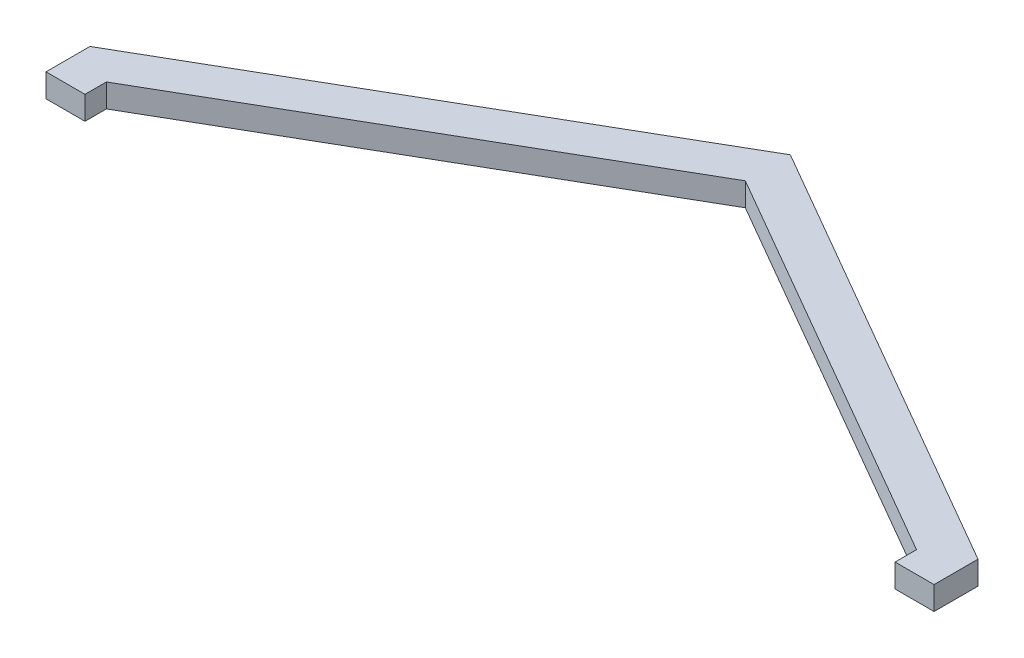
ISO-10303-21;
HEADER;
FILE_DESCRIPTION(('STEP AP214'),'2;1');
FILE_NAME('part.step','',(''),(''),'','','');
FILE_SCHEMA(('AUTOMOTIVE_DESIGN { 1 0 10303 214 1 1 1 1 }'));
ENDSEC;
DATA;
#1=APPLICATION_CONTEXT('core data for automotive mechanical design processes');
#2=APPLICATION_PROTOCOL_DEFINITION('international standard','automotive_design',2000,#1);
#3=PRODUCT_CONTEXT('',#1,'mechanical');
#4=PRODUCT('Part','Part','',(#3));
#5=PRODUCT_RELATED_PRODUCT_CATEGORY('part','',(#4));
#6=PRODUCT_DEFINITION_FORMATION('','',#4);
#7=PRODUCT_DEFINITION_CONTEXT('part definition',#1,'design');
#8=PRODUCT_DEFINITION('design','',#6,#7);
#9=PRODUCT_DEFINITION_SHAPE('','',#8);
#10=(LENGTH_UNIT() NAMED_UNIT(*) SI_UNIT(.MILLI.,.METRE.));
#11=(NAMED_UNIT(*) PLANE_ANGLE_UNIT() SI_UNIT($,.RADIAN.));
#12=(NAMED_UNIT(*) SI_UNIT($,.STERADIAN.) SOLID_ANGLE_UNIT());
#13=UNCERTAINTY_MEASURE_WITH_UNIT(LENGTH_MEASURE(1.E-05),#10,'distance_accuracy_value','');
#14=(GEOMETRIC_REPRESENTATION_CONTEXT(3) GLOBAL_UNCERTAINTY_ASSIGNED_CONTEXT((#13)) GLOBAL_UNIT_ASSIGNED_CONTEXT((#10,
#11,#12)) REPRESENTATION_CONTEXT('',''));
#15=CARTESIAN_POINT('',(0.,0.,0.));
#16=DIRECTION('',(0.,0.,1.));
#17=DIRECTION('',(1.,0.,0.));
#18=AXIS2_PLACEMENT_3D('',#15,#16,#17);
#19=CARTESIAN_POINT('',(-71.9715242270662,-8.99999999999997,-27.25));
#20=DIRECTION('',(0.,-1.,0.));
#21=DIRECTION('',(0.,0.,-1.));
#22=AXIS2_PLACEMENT_3D('',#19,#20,#21);
#23=PLANE('',#22);
#24=DIRECTION('',(-0.866025403784439,0.,0.5));
#25=VECTOR('',#24,1.);
#26=CARTESIAN_POINT('',(0.,-9.,-65.7735026918963));
#27=LINE('',#26,#25);
#28=CARTESIAN_POINT('',(0.,-8.99999999999997,-65.7735026918963));
#29=VERTEX_POINT('',#28);
#30=CARTESIAN_POINT('',(-56.9615242270663,-9.,-32.8867513459481));
#31=VERTEX_POINT('',#30);
#32=EDGE_CURVE('E59',#29,#31,#27,.T.);
#33=ORIENTED_EDGE('',*,*,#32,.F.);
#34=DIRECTION('',(-0.866025403784439,0.,-0.5));
#35=VECTOR('',#34,1.);
#36=CARTESIAN_POINT('',(56.9615242270663,-9.,-32.8867513459481));
#37=LINE('',#36,#35);
#38=CARTESIAN_POINT('',(56.9615242270663,-9.,-32.8867513459481));
#39=VERTEX_POINT('',#38);
#40=EDGE_CURVE('E121',#39,#29,#37,.T.);
#41=ORIENTED_EDGE('',*,*,#40,.F.);
#42=DIRECTION('',(0.,0.,-1.));
#43=VECTOR('',#42,1.);
#44=CARTESIAN_POINT('',(56.9615242270663,-9.,0.));
#45=LINE('',#44,#43);
#46=CARTESIAN_POINT('',(56.9615242270663,-9.,-27.25));
#47=VERTEX_POINT('',#46);
#48=EDGE_CURVE('E119',#47,#39,#45,.T.);
#49=ORIENTED_EDGE('',*,*,#48,.F.);
#50=DIRECTION('',(1.,0.,0.));
#51=VECTOR('',#50,1.);
#52=CARTESIAN_POINT('',(-113.272742430532,-8.99999999999997,-27.25));
#53=LINE('',#52,#51);
#54=CARTESIAN_POINT('',(51.9615242270662,-8.99999999999997,-27.25));
#55=VERTEX_POINT('',#54);
#56=EDGE_CURVE('E11',#55,#47,#53,.T.);
#57=ORIENTED_EDGE('',*,*,#56,.F.);
#58=DIRECTION('',(0.,0.,1.));
#59=VECTOR('',#58,1.);
#60=CARTESIAN_POINT('',(51.9615242270663,-8.99999999999997,-1.8027775184846E-13));
#61=LINE('',#60,#59);
#62=CARTESIAN_POINT('',(51.9615242270662,-8.99999999999997,-29.9999999999998));
#63=VERTEX_POINT('',#62);
#64=EDGE_CURVE('E162',#63,#55,#61,.T.);
#65=ORIENTED_EDGE('',*,*,#64,.F.);
#66=DIRECTION('',(0.866025403784438,0.,0.500000000000001));
#67=VECTOR('',#66,1.);
#68=CARTESIAN_POINT('',(25.9807621135331,-8.99999999999997,-44.9999999999998));
#69=LINE('',#68,#67);
#70=CARTESIAN_POINT('',(0.,-8.99999999999997,-59.9999999999999));
#71=VERTEX_POINT('',#70);
#72=EDGE_CURVE('E164',#71,#63,#69,.T.);
#73=ORIENTED_EDGE('',*,*,#72,.F.);
#74=DIRECTION('',(0.866025403784439,0.,-0.499999999999999));
#75=VECTOR('',#74,1.);
#76=CARTESIAN_POINT('',(-25.9807621135331,-8.99999999999997,-44.9999999999999));
#77=LINE('',#76,#75);
#78=CARTESIAN_POINT('',(-51.9615242270664,-8.99999999999997,-29.9999999999999));
#79=VERTEX_POINT('',#78);
#80=EDGE_CURVE('E166',#79,#71,#77,.T.);
#81=ORIENTED_EDGE('',*,*,#80,.F.);
#82=DIRECTION('',(0.,0.,-1.));
#83=VECTOR('',#82,1.);
#84=CARTESIAN_POINT('',(-51.9615242270664,-8.99999999999997,0.));
#85=LINE('',#84,#83);
#86=CARTESIAN_POINT('',(-51.9615242270664,-8.99999999999997,-27.25));
#87=VERTEX_POINT('',#86);
#88=EDGE_CURVE('E46',#87,#79,#85,.T.);
#89=ORIENTED_EDGE('',*,*,#88,.F.);
#90=DIRECTION('',(1.,0.,0.));
#91=VECTOR('',#90,1.);
#92=CARTESIAN_POINT('',(-113.272742430532,-8.99999999999997,-27.25));
#93=LINE('',#92,#91);
#94=CARTESIAN_POINT('',(-56.9615242270663,-9.,-27.25));
#95=VERTEX_POINT('',#94);
#96=EDGE_CURVE('E51',#95,#87,#93,.T.);
#97=ORIENTED_EDGE('',*,*,#96,.F.);
#98=DIRECTION('',(0.,0.,1.));
#99=VECTOR('',#98,1.);
#100=CARTESIAN_POINT('',(-56.9615242270663,-9.,-32.8867513459481));
#101=LINE('',#100,#99);
#102=EDGE_CURVE('E150',#31,#95,#101,.T.);
#103=ORIENTED_EDGE('',*,*,#102,.F.);
#104=EDGE_LOOP('',(#33,#41,#49,#57,#65,#73,#81,#89,#97,#103));
#105=FACE_BOUND('',#104,.T.);
#106=ADVANCED_FACE('F43',(#105),#23,.T.);
#107=CARTESIAN_POINT('',(-25.9807621135331,-12.,-44.9999999999999));
#108=DIRECTION('',(0.499999999999999,0.,0.866025403784439));
#109=DIRECTION('',(0.866025403784439,0.,-0.499999999999999));
#110=AXIS2_PLACEMENT_3D('',#107,#108,#109);
#111=PLANE('',#110);
#112=DIRECTION('',(0.,1.,0.));
#113=VECTOR('',#112,1.);
#114=CARTESIAN_POINT('',(-51.9615242270664,-12.,-29.9999999999999));
#115=LINE('',#114,#113);
#116=CARTESIAN_POINT('',(-51.9615242270664,-6.,-29.9999999999999));
#117=VERTEX_POINT('',#116);
#118=EDGE_CURVE('E174',#79,#117,#115,.T.);
#119=ORIENTED_EDGE('',*,*,#118,.F.);
#120=ORIENTED_EDGE('',*,*,#80,.T.);
#121=DIRECTION('',(0.,1.,0.));
#122=VECTOR('',#121,1.);
#123=CARTESIAN_POINT('',(0.,-12.,-59.9999999999999));
#124=LINE('',#123,#122);
#125=CARTESIAN_POINT('',(0.,-6.,-59.9999999999999));
#126=VERTEX_POINT('',#125);
#127=EDGE_CURVE('E182',#71,#126,#124,.T.);
#128=ORIENTED_EDGE('',*,*,#127,.T.);
#129=DIRECTION('',(-0.866025403784439,0.,0.499999999999999));
#130=VECTOR('',#129,1.);
#131=CARTESIAN_POINT('',(0.,-6.,-59.9999999999999));
#132=LINE('',#131,#130);
#133=EDGE_CURVE('E160',#126,#117,#132,.T.);
#134=ORIENTED_EDGE('',*,*,#133,.T.);
#135=EDGE_LOOP('',(#119,#120,#128,#134));
#136=FACE_BOUND('',#135,.T.);
#137=ADVANCED_FACE('F178',(#136),#111,.T.);
#138=CARTESIAN_POINT('',(25.9807621135331,-12.,-44.9999999999998));
#139=DIRECTION('',(-0.500000000000001,0.,0.866025403784438));
#140=DIRECTION('',(0.866025403784438,0.,0.500000000000001));
#141=AXIS2_PLACEMENT_3D('',#138,#139,#140);
#142=PLANE('',#141);
#143=ORIENTED_EDGE('',*,*,#127,.F.);
#144=ORIENTED_EDGE('',*,*,#72,.T.);
#145=DIRECTION('',(0.,1.,0.));
#146=VECTOR('',#145,1.);
#147=CARTESIAN_POINT('',(51.9615242270662,-12.,-29.9999999999998));
#148=LINE('',#147,#146);
#149=CARTESIAN_POINT('',(51.9615242270662,-6.,-29.9999999999998));
#150=VERTEX_POINT('',#149);
#151=EDGE_CURVE('E126',#63,#150,#148,.T.);
#152=ORIENTED_EDGE('',*,*,#151,.T.);
#153=DIRECTION('',(-0.866025403784438,0.,-0.500000000000001));
#154=VECTOR('',#153,1.);
#155=CARTESIAN_POINT('',(51.9615242270662,-6.,-29.9999999999998));
#156=LINE('',#155,#154);
#157=EDGE_CURVE('E157',#150,#126,#156,.T.);
#158=ORIENTED_EDGE('',*,*,#157,.T.);
#159=EDGE_LOOP('',(#143,#144,#152,#158));
#160=FACE_BOUND('',#159,.T.);
#161=ADVANCED_FACE('F210',(#160),#142,.T.);
#162=CARTESIAN_POINT('',(56.9615242270675,-12.,0.));
#163=DIRECTION('',(-1.,0.,0.));
#164=DIRECTION('',(0.,0.,1.));
#165=AXIS2_PLACEMENT_3D('',#162,#163,#164);
#166=PLANE('',#165);
#167=DIRECTION('',(0.,1.,0.));
#168=VECTOR('',#167,1.);
#169=CARTESIAN_POINT('',(56.9615242270675,-12.,-27.25));
#170=LINE('',#169,#168);
#171=CARTESIAN_POINT('',(56.9615242270663,-6.,-27.25));
#172=VERTEX_POINT('',#171);
#173=EDGE_CURVE('E133',#47,#172,#170,.T.);
#174=ORIENTED_EDGE('',*,*,#173,.F.);
#175=ORIENTED_EDGE('',*,*,#48,.T.);
#176=DIRECTION('',(0.,-1.,0.));
#177=VECTOR('',#176,1.);
#178=CARTESIAN_POINT('',(56.9615242270663,-6.,-32.8867513459481));
#179=LINE('',#178,#177);
#180=CARTESIAN_POINT('',(56.9615242270663,-6.,-32.8867513459481));
#181=VERTEX_POINT('',#180);
#182=EDGE_CURVE('E181',#181,#39,#179,.T.);
#183=ORIENTED_EDGE('',*,*,#182,.F.);
#184=DIRECTION('',(0.,0.,-1.));
#185=VECTOR('',#184,1.);
#186=CARTESIAN_POINT('',(56.9615242270663,-6.,32.8867513459481));
#187=LINE('',#186,#185);
#188=EDGE_CURVE('E137',#172,#181,#187,.T.);
#189=ORIENTED_EDGE('',*,*,#188,.F.);
#190=EDGE_LOOP('',(#174,#175,#183,#189));
#191=FACE_BOUND('',#190,.T.);
#192=ADVANCED_FACE('F136',(#191),#166,.F.);
#193=CARTESIAN_POINT('',(51.9615242270663,-12.,-1.8027775184846E-13));
#194=DIRECTION('',(-1.,0.,0.));
#195=DIRECTION('',(0.,0.,1.));
#196=AXIS2_PLACEMENT_3D('',#193,#194,#195);
#197=PLANE('',#196);
#198=ORIENTED_EDGE('',*,*,#151,.F.);
#199=ORIENTED_EDGE('',*,*,#64,.T.);
#200=DIRECTION('',(0.,1.,0.));
#201=VECTOR('',#200,1.);
#202=CARTESIAN_POINT('',(51.9615242270662,-12.,-27.25));
#203=LINE('',#202,#201);
#204=CARTESIAN_POINT('',(51.9615242270662,-6.,-27.25));
#205=VERTEX_POINT('',#204);
#206=EDGE_CURVE('E135',#55,#205,#203,.T.);
#207=ORIENTED_EDGE('',*,*,#206,.T.);
#208=DIRECTION('',(0.,0.,-1.));
#209=VECTOR('',#208,1.);
#210=CARTESIAN_POINT('',(51.9615242270664,-6.,29.9999999999998));
#211=LINE('',#210,#209);
#212=EDGE_CURVE('E153',#205,#150,#211,.T.);
#213=ORIENTED_EDGE('',*,*,#212,.T.);
#214=EDGE_LOOP('',(#198,#199,#207,#213));
#215=FACE_BOUND('',#214,.T.);
#216=ADVANCED_FACE('F204',(#215),#197,.T.);
#217=CARTESIAN_POINT('',(-113.272742430532,-42.01,-27.25));
#218=DIRECTION('',(0.,0.,1.));
#219=DIRECTION('',(1.,0.,0.));
#220=AXIS2_PLACEMENT_3D('',#217,#218,#219);
#221=PLANE('',#220);
#222=ORIENTED_EDGE('',*,*,#206,.F.);
#223=ORIENTED_EDGE('',*,*,#56,.T.);
#224=ORIENTED_EDGE('',*,*,#173,.T.);
#225=DIRECTION('',(1.,0.,0.));
#226=VECTOR('',#225,1.);
#227=CARTESIAN_POINT('',(0.,-6.,-27.25));
#228=LINE('',#227,#226);
#229=EDGE_CURVE('E127',#205,#172,#228,.T.);
#230=ORIENTED_EDGE('',*,*,#229,.F.);
#231=EDGE_LOOP('',(#222,#223,#224,#230));
#232=FACE_BOUND('',#231,.T.);
#233=ADVANCED_FACE('F131',(#232),#221,.T.);
#234=CARTESIAN_POINT('',(28.4807621135322,-12.,-49.3301270189205));
#235=DIRECTION('',(-0.5,0.,0.866025403784439));
#236=DIRECTION('',(0.866025403784439,0.,0.5));
#237=AXIS2_PLACEMENT_3D('',#234,#235,#236);
#238=PLANE('',#237);
#239=ORIENTED_EDGE('',*,*,#40,.T.);
#240=DIRECTION('',(0.,-1.,0.));
#241=VECTOR('',#240,1.);
#242=CARTESIAN_POINT('',(0.,-6.,-65.7735026918963));
#243=LINE('',#242,#241);
#244=CARTESIAN_POINT('',(0.,-6.,-65.7735026918963));
#245=VERTEX_POINT('',#244);
#246=EDGE_CURVE('E184',#245,#29,#243,.T.);
#247=ORIENTED_EDGE('',*,*,#246,.F.);
#248=DIRECTION('',(-0.866025403784439,0.,-0.5));
#249=VECTOR('',#248,1.);
#250=CARTESIAN_POINT('',(56.9615242270663,-6.,-32.8867513459481));
#251=LINE('',#250,#249);
#252=EDGE_CURVE('E151',#181,#245,#251,.T.);
#253=ORIENTED_EDGE('',*,*,#252,.F.);
#254=ORIENTED_EDGE('',*,*,#182,.T.);
#255=EDGE_LOOP('',(#239,#247,#253,#254));
#256=FACE_BOUND('',#255,.T.);
#257=ADVANCED_FACE('F235',(#256),#238,.F.);
#258=CARTESIAN_POINT('',(-51.9615242270664,-12.,0.));
#259=DIRECTION('',(1.,0.,0.));
#260=DIRECTION('',(0.,0.,-1.));
#261=AXIS2_PLACEMENT_3D('',#258,#259,#260);
#262=PLANE('',#261);
#263=DIRECTION('',(0.,-1.,0.));
#264=VECTOR('',#263,1.);
#265=CARTESIAN_POINT('',(-51.9615242270664,-12.,-27.25));
#266=LINE('',#265,#264);
#267=CARTESIAN_POINT('',(-51.9615242270664,-6.,-27.25));
#268=VERTEX_POINT('',#267);
#269=EDGE_CURVE('E177',#268,#87,#266,.T.);
#270=ORIENTED_EDGE('',*,*,#269,.T.);
#271=ORIENTED_EDGE('',*,*,#88,.T.);
#272=ORIENTED_EDGE('',*,*,#118,.T.);
#273=DIRECTION('',(0.,0.,1.));
#274=VECTOR('',#273,1.);
#275=CARTESIAN_POINT('',(-51.9615242270664,-6.,-29.9999999999999));
#276=LINE('',#275,#274);
#277=EDGE_CURVE('E156',#117,#268,#276,.T.);
#278=ORIENTED_EDGE('',*,*,#277,.T.);
#279=EDGE_LOOP('',(#270,#271,#272,#278));
#280=FACE_BOUND('',#279,.T.);
#281=ADVANCED_FACE('F173',(#280),#262,.T.);
#282=CARTESIAN_POINT('',(-56.9615242270663,-12.,0.));
#283=DIRECTION('',(1.,0.,0.));
#284=DIRECTION('',(0.,0.,-1.));
#285=AXIS2_PLACEMENT_3D('',#282,#283,#284);
#286=PLANE('',#285);
#287=DIRECTION('',(0.,-1.,0.));
#288=VECTOR('',#287,1.);
#289=CARTESIAN_POINT('',(-56.9615242270663,-12.,-27.25));
#290=LINE('',#289,#288);
#291=CARTESIAN_POINT('',(-56.9615242270663,-6.,-27.25));
#292=VERTEX_POINT('',#291);
#293=EDGE_CURVE('E138',#292,#95,#290,.T.);
#294=ORIENTED_EDGE('',*,*,#293,.F.);
#295=DIRECTION('',(0.,0.,1.));
#296=VECTOR('',#295,1.);
#297=CARTESIAN_POINT('',(-56.9615242270663,-6.,-32.8867513459481));
#298=LINE('',#297,#296);
#299=CARTESIAN_POINT('',(-56.9615242270663,-6.,-32.8867513459481));
#300=VERTEX_POINT('',#299);
#301=EDGE_CURVE('E144',#300,#292,#298,.T.);
#302=ORIENTED_EDGE('',*,*,#301,.F.);
#303=DIRECTION('',(0.,-1.,0.));
#304=VECTOR('',#303,1.);
#305=CARTESIAN_POINT('',(-56.9615242270663,-6.,-32.8867513459481));
#306=LINE('',#305,#304);
#307=EDGE_CURVE('E148',#300,#31,#306,.T.);
#308=ORIENTED_EDGE('',*,*,#307,.T.);
#309=ORIENTED_EDGE('',*,*,#102,.T.);
#310=EDGE_LOOP('',(#294,#302,#308,#309));
#311=FACE_BOUND('',#310,.T.);
#312=ADVANCED_FACE('F231',(#311),#286,.F.);
#313=ORIENTED_EDGE('',*,*,#293,.T.);
#314=ORIENTED_EDGE('',*,*,#96,.T.);
#315=ORIENTED_EDGE('',*,*,#269,.F.);
#316=EDGE_CURVE('E200',#292,#268,#228,.T.);
#317=ORIENTED_EDGE('',*,*,#316,.F.);
#318=EDGE_LOOP('',(#313,#314,#315,#317));
#319=FACE_BOUND('',#318,.T.);
#320=ADVANCED_FACE('F225',(#319),#221,.T.);
#321=CARTESIAN_POINT('',(-28.4807621135319,-12.,-49.3301270189201));
#322=DIRECTION('',(0.5,0.,0.866025403784439));
#323=DIRECTION('',(0.866025403784439,0.,-0.5));
#324=AXIS2_PLACEMENT_3D('',#321,#322,#323);
#325=PLANE('',#324);
#326=ORIENTED_EDGE('',*,*,#32,.T.);
#327=ORIENTED_EDGE('',*,*,#307,.F.);
#328=DIRECTION('',(-0.866025403784439,0.,0.5));
#329=VECTOR('',#328,1.);
#330=CARTESIAN_POINT('',(0.,-6.,-65.7735026918963));
#331=LINE('',#330,#329);
#332=EDGE_CURVE('E147',#245,#300,#331,.T.);
#333=ORIENTED_EDGE('',*,*,#332,.F.);
#334=ORIENTED_EDGE('',*,*,#246,.T.);
#335=EDGE_LOOP('',(#326,#327,#333,#334));
#336=FACE_BOUND('',#335,.T.);
#337=ADVANCED_FACE('F221',(#336),#325,.F.);
#338=CARTESIAN_POINT('',(0.,-6.,0.));
#339=DIRECTION('',(0.,1.,0.));
#340=DIRECTION('',(0.,0.,1.));
#341=AXIS2_PLACEMENT_3D('',#338,#339,#340);
#342=PLANE('',#341);
#343=ORIENTED_EDGE('',*,*,#301,.T.);
#344=ORIENTED_EDGE('',*,*,#316,.T.);
#345=ORIENTED_EDGE('',*,*,#277,.F.);
#346=ORIENTED_EDGE('',*,*,#133,.F.);
#347=ORIENTED_EDGE('',*,*,#157,.F.);
#348=ORIENTED_EDGE('',*,*,#212,.F.);
#349=ORIENTED_EDGE('',*,*,#229,.T.);
#350=ORIENTED_EDGE('',*,*,#188,.T.);
#351=ORIENTED_EDGE('',*,*,#252,.T.);
#352=ORIENTED_EDGE('',*,*,#332,.T.);
#353=EDGE_LOOP('',(#343,#344,#345,#346,#347,#348,#349,#350,#351,#352));
#354=FACE_BOUND('',#353,.T.);
#355=ADVANCED_FACE('F208',(#354),#342,.T.);
#356=CLOSED_SHELL('',(#106,#137,#161,#192,#216,#233,#257,#281,#312,#320,#337,#355));
#357=MANIFOLD_SOLID_BREP('B2',#356);
#358=ADVANCED_BREP_SHAPE_REPRESENTATION('',(#18,#357),#14);
#359=SHAPE_DEFINITION_REPRESENTATION(#9,#358);
ENDSEC;
END-ISO-10303-21;
